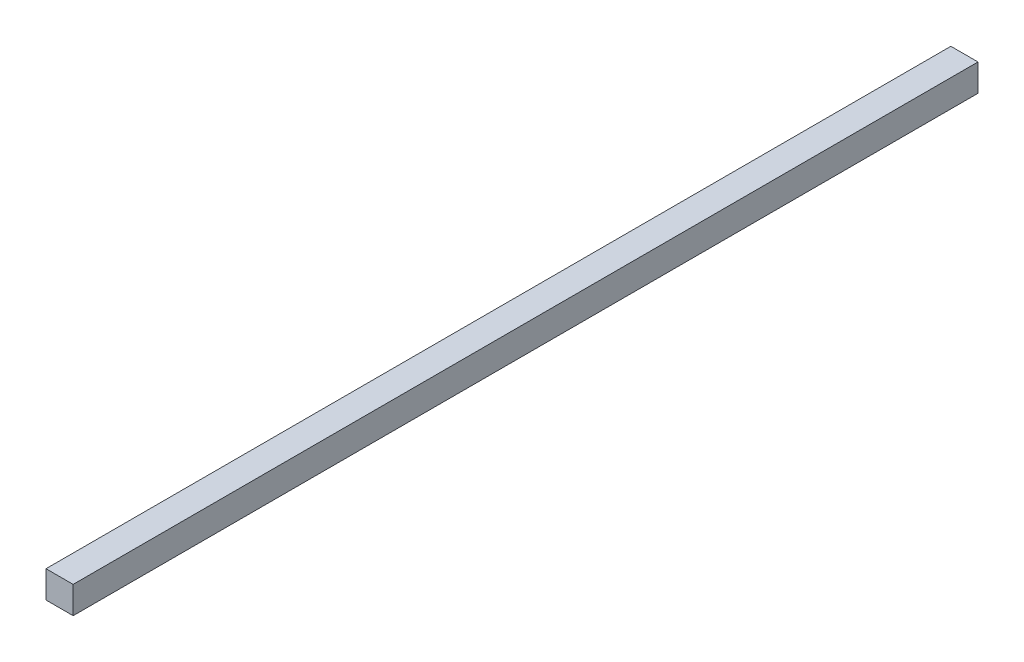
ISO-10303-21;
HEADER;
FILE_DESCRIPTION(('STEP AP214'),'2;1');
FILE_NAME('part.step','',(''),(''),'','','');
FILE_SCHEMA(('AUTOMOTIVE_DESIGN { 1 0 10303 214 1 1 1 1 }'));
ENDSEC;
DATA;
#1=APPLICATION_CONTEXT('core data for automotive mechanical design processes');
#2=APPLICATION_PROTOCOL_DEFINITION('international standard','automotive_design',2000,#1);
#3=PRODUCT_CONTEXT('',#1,'mechanical');
#4=PRODUCT('Part','Part','',(#3));
#5=PRODUCT_RELATED_PRODUCT_CATEGORY('part','',(#4));
#6=PRODUCT_DEFINITION_FORMATION('','',#4);
#7=PRODUCT_DEFINITION_CONTEXT('part definition',#1,'design');
#8=PRODUCT_DEFINITION('design','',#6,#7);
#9=PRODUCT_DEFINITION_SHAPE('','',#8);
#10=(LENGTH_UNIT() NAMED_UNIT(*) SI_UNIT(.MILLI.,.METRE.));
#11=(NAMED_UNIT(*) PLANE_ANGLE_UNIT() SI_UNIT($,.RADIAN.));
#12=(NAMED_UNIT(*) SI_UNIT($,.STERADIAN.) SOLID_ANGLE_UNIT());
#13=UNCERTAINTY_MEASURE_WITH_UNIT(LENGTH_MEASURE(1.E-05),#10,'distance_accuracy_value','');
#14=(GEOMETRIC_REPRESENTATION_CONTEXT(3) GLOBAL_UNCERTAINTY_ASSIGNED_CONTEXT((#13)) GLOBAL_UNIT_ASSIGNED_CONTEXT((#10,
#11,#12)) REPRESENTATION_CONTEXT('',''));
#15=CARTESIAN_POINT('',(0.,0.,0.));
#16=DIRECTION('',(0.,0.,1.));
#17=DIRECTION('',(1.,0.,0.));
#18=AXIS2_PLACEMENT_3D('',#15,#16,#17);
#19=CARTESIAN_POINT('',(15.,-15.,1000.));
#20=DIRECTION('',(-1.,0.,0.));
#21=DIRECTION('',(0.,-1.,0.));
#22=AXIS2_PLACEMENT_3D('',#19,#20,#21);
#23=PLANE('',#22);
#24=DIRECTION('',(0.,1.,0.));
#25=VECTOR('',#24,1.);
#26=CARTESIAN_POINT('',(15.,-15.,0.));
#27=LINE('',#26,#25);
#28=CARTESIAN_POINT('',(15.,-15.,0.));
#29=VERTEX_POINT('',#28);
#30=CARTESIAN_POINT('',(15.,15.,0.));
#31=VERTEX_POINT('',#30);
#32=EDGE_CURVE('E102',#29,#31,#27,.T.);
#33=ORIENTED_EDGE('',*,*,#32,.T.);
#34=DIRECTION('',(0.,0.,-1.));
#35=VECTOR('',#34,1.);
#36=CARTESIAN_POINT('',(15.,15.,1000.));
#37=LINE('',#36,#35);
#38=CARTESIAN_POINT('',(15.,15.,1000.));
#39=VERTEX_POINT('',#38);
#40=EDGE_CURVE('E11',#39,#31,#37,.T.);
#41=ORIENTED_EDGE('',*,*,#40,.F.);
#42=DIRECTION('',(0.,1.,0.));
#43=VECTOR('',#42,1.);
#44=CARTESIAN_POINT('',(15.,-15.,1000.));
#45=LINE('',#44,#43);
#46=CARTESIAN_POINT('',(15.,-15.,1000.));
#47=VERTEX_POINT('',#46);
#48=EDGE_CURVE('E90',#47,#39,#45,.T.);
#49=ORIENTED_EDGE('',*,*,#48,.F.);
#50=DIRECTION('',(0.,0.,-1.));
#51=VECTOR('',#50,1.);
#52=CARTESIAN_POINT('',(15.,-15.,1000.));
#53=LINE('',#52,#51);
#54=EDGE_CURVE('E98',#47,#29,#53,.T.);
#55=ORIENTED_EDGE('',*,*,#54,.T.);
#56=EDGE_LOOP('',(#33,#41,#49,#55));
#57=FACE_BOUND('',#56,.T.);
#58=ADVANCED_FACE('F39',(#57),#23,.F.);
#59=CARTESIAN_POINT('',(-15.,15.,1000.));
#60=DIRECTION('',(0.,-1.,0.));
#61=DIRECTION('',(1.,0.,0.));
#62=AXIS2_PLACEMENT_3D('',#59,#60,#61);
#63=PLANE('',#62);
#64=DIRECTION('',(-1.,0.,0.));
#65=VECTOR('',#64,1.);
#66=CARTESIAN_POINT('',(-15.,15.,0.));
#67=LINE('',#66,#65);
#68=CARTESIAN_POINT('',(-15.,15.,0.));
#69=VERTEX_POINT('',#68);
#70=EDGE_CURVE('E94',#31,#69,#67,.T.);
#71=ORIENTED_EDGE('',*,*,#70,.T.);
#72=DIRECTION('',(0.,0.,-1.));
#73=VECTOR('',#72,1.);
#74=CARTESIAN_POINT('',(-15.,15.,1000.));
#75=LINE('',#74,#73);
#76=CARTESIAN_POINT('',(-15.,15.,1000.));
#77=VERTEX_POINT('',#76);
#78=EDGE_CURVE('E47',#77,#69,#75,.T.);
#79=ORIENTED_EDGE('',*,*,#78,.F.);
#80=DIRECTION('',(-1.,0.,0.));
#81=VECTOR('',#80,1.);
#82=CARTESIAN_POINT('',(-15.,15.,1000.));
#83=LINE('',#82,#81);
#84=EDGE_CURVE('E85',#39,#77,#83,.T.);
#85=ORIENTED_EDGE('',*,*,#84,.F.);
#86=ORIENTED_EDGE('',*,*,#40,.T.);
#87=EDGE_LOOP('',(#71,#79,#85,#86));
#88=FACE_BOUND('',#87,.T.);
#89=ADVANCED_FACE('F93',(#88),#63,.F.);
#90=CARTESIAN_POINT('',(-15.,-15.,1000.));
#91=DIRECTION('',(1.,0.,0.));
#92=DIRECTION('',(0.,0.,-1.));
#93=AXIS2_PLACEMENT_3D('',#90,#91,#92);
#94=PLANE('',#93);
#95=DIRECTION('',(0.,-1.,0.));
#96=VECTOR('',#95,1.);
#97=CARTESIAN_POINT('',(-15.,-15.,0.));
#98=LINE('',#97,#96);
#99=CARTESIAN_POINT('',(-15.,-15.,0.));
#100=VERTEX_POINT('',#99);
#101=EDGE_CURVE('E72',#69,#100,#98,.T.);
#102=ORIENTED_EDGE('',*,*,#101,.T.);
#103=DIRECTION('',(0.,0.,-1.));
#104=VECTOR('',#103,1.);
#105=CARTESIAN_POINT('',(-15.,-15.,1000.));
#106=LINE('',#105,#104);
#107=CARTESIAN_POINT('',(-15.,-15.,1000.));
#108=VERTEX_POINT('',#107);
#109=EDGE_CURVE('E95',#108,#100,#106,.T.);
#110=ORIENTED_EDGE('',*,*,#109,.F.);
#111=DIRECTION('',(0.,-1.,0.));
#112=VECTOR('',#111,1.);
#113=CARTESIAN_POINT('',(-15.,-15.,1000.));
#114=LINE('',#113,#112);
#115=EDGE_CURVE('E88',#77,#108,#114,.T.);
#116=ORIENTED_EDGE('',*,*,#115,.F.);
#117=ORIENTED_EDGE('',*,*,#78,.T.);
#118=EDGE_LOOP('',(#102,#110,#116,#117));
#119=FACE_BOUND('',#118,.T.);
#120=ADVANCED_FACE('F96',(#119),#94,.F.);
#121=CARTESIAN_POINT('',(-15.,-15.,1000.));
#122=DIRECTION('',(0.,1.,0.));
#123=DIRECTION('',(-1.,0.,0.));
#124=AXIS2_PLACEMENT_3D('',#121,#122,#123);
#125=PLANE('',#124);
#126=DIRECTION('',(1.,0.,0.));
#127=VECTOR('',#126,1.);
#128=CARTESIAN_POINT('',(-15.,-15.,0.));
#129=LINE('',#128,#127);
#130=EDGE_CURVE('E78',#100,#29,#129,.T.);
#131=ORIENTED_EDGE('',*,*,#130,.T.);
#132=ORIENTED_EDGE('',*,*,#54,.F.);
#133=DIRECTION('',(1.,0.,0.));
#134=VECTOR('',#133,1.);
#135=CARTESIAN_POINT('',(-15.,-15.,1000.));
#136=LINE('',#135,#134);
#137=EDGE_CURVE('E55',#108,#47,#136,.T.);
#138=ORIENTED_EDGE('',*,*,#137,.F.);
#139=ORIENTED_EDGE('',*,*,#109,.T.);
#140=EDGE_LOOP('',(#131,#132,#138,#139));
#141=FACE_BOUND('',#140,.T.);
#142=ADVANCED_FACE('F109',(#141),#125,.F.);
#143=CARTESIAN_POINT('',(0.,0.,1000.));
#144=DIRECTION('',(0.,0.,-1.));
#145=DIRECTION('',(-1.,0.,0.));
#146=AXIS2_PLACEMENT_3D('',#143,#144,#145);
#147=PLANE('',#146);
#148=ORIENTED_EDGE('',*,*,#48,.T.);
#149=ORIENTED_EDGE('',*,*,#84,.T.);
#150=ORIENTED_EDGE('',*,*,#115,.T.);
#151=ORIENTED_EDGE('',*,*,#137,.T.);
#152=EDGE_LOOP('',(#148,#149,#150,#151));
#153=FACE_BOUND('',#152,.T.);
#154=ADVANCED_FACE('F86',(#153),#147,.F.);
#155=CARTESIAN_POINT('',(0.,0.,0.));
#156=DIRECTION('',(0.,0.,-1.));
#157=DIRECTION('',(-1.,0.,0.));
#158=AXIS2_PLACEMENT_3D('',#155,#156,#157);
#159=PLANE('',#158);
#160=ORIENTED_EDGE('',*,*,#32,.F.);
#161=ORIENTED_EDGE('',*,*,#130,.F.);
#162=ORIENTED_EDGE('',*,*,#101,.F.);
#163=ORIENTED_EDGE('',*,*,#70,.F.);
#164=EDGE_LOOP('',(#160,#161,#162,#163));
#165=FACE_BOUND('',#164,.T.);
#166=ADVANCED_FACE('F112',(#165),#159,.T.);
#167=CLOSED_SHELL('',(#58,#89,#120,#142,#154,#166));
#168=MANIFOLD_SOLID_BREP('B2',#167);
#169=ADVANCED_BREP_SHAPE_REPRESENTATION('',(#18,#168),#14);
#170=SHAPE_DEFINITION_REPRESENTATION(#9,#169);
ENDSEC;
END-ISO-10303-21;
